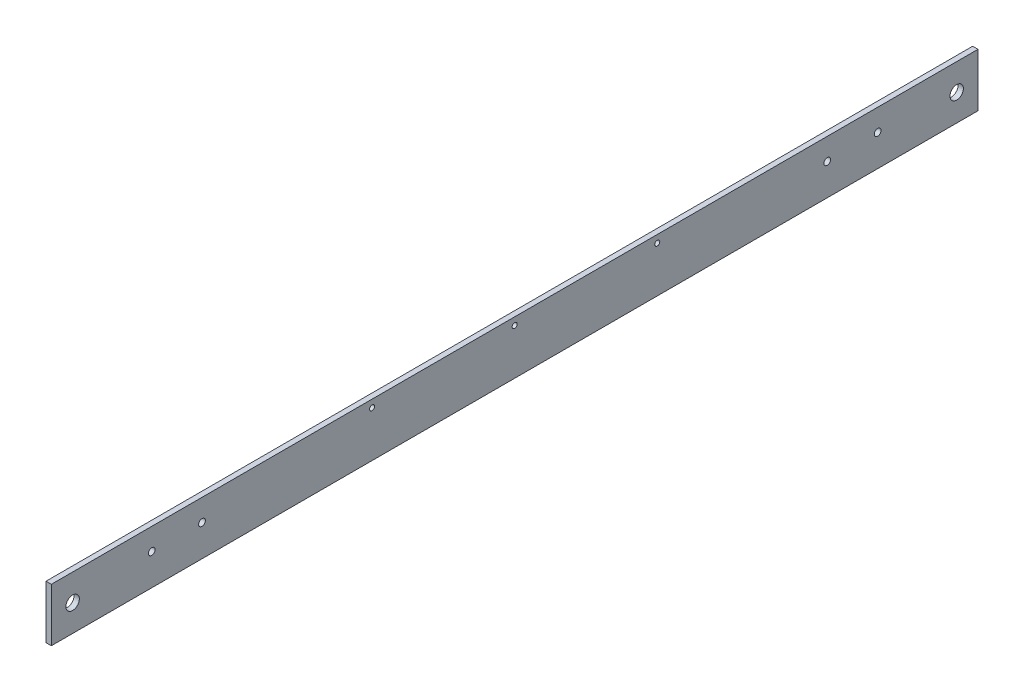
ISO-10303-21;
HEADER;
FILE_DESCRIPTION(('STEP AP214'),'2;1');
FILE_NAME('part.step','',(''),(''),'','','');
FILE_SCHEMA(('AUTOMOTIVE_DESIGN { 1 0 10303 214 1 1 1 1 }'));
ENDSEC;
DATA;
#1=APPLICATION_CONTEXT('core data for automotive mechanical design processes');
#2=APPLICATION_PROTOCOL_DEFINITION('international standard','automotive_design',2000,#1);
#3=PRODUCT_CONTEXT('',#1,'mechanical');
#4=PRODUCT('Part','Part','',(#3));
#5=PRODUCT_RELATED_PRODUCT_CATEGORY('part','',(#4));
#6=PRODUCT_DEFINITION_FORMATION('','',#4);
#7=PRODUCT_DEFINITION_CONTEXT('part definition',#1,'design');
#8=PRODUCT_DEFINITION('design','',#6,#7);
#9=PRODUCT_DEFINITION_SHAPE('','',#8);
#10=(LENGTH_UNIT() NAMED_UNIT(*) SI_UNIT(.MILLI.,.METRE.));
#11=(NAMED_UNIT(*) PLANE_ANGLE_UNIT() SI_UNIT($,.RADIAN.));
#12=(NAMED_UNIT(*) SI_UNIT($,.STERADIAN.) SOLID_ANGLE_UNIT());
#13=UNCERTAINTY_MEASURE_WITH_UNIT(LENGTH_MEASURE(1.E-05),#10,'distance_accuracy_value','');
#14=(GEOMETRIC_REPRESENTATION_CONTEXT(3) GLOBAL_UNCERTAINTY_ASSIGNED_CONTEXT((#13)) GLOBAL_UNIT_ASSIGNED_CONTEXT((#10,
#11,#12)) REPRESENTATION_CONTEXT('',''));
#15=CARTESIAN_POINT('',(0.,0.,0.));
#16=DIRECTION('',(0.,0.,1.));
#17=DIRECTION('',(1.,0.,0.));
#18=AXIS2_PLACEMENT_3D('',#15,#16,#17);
#19=CARTESIAN_POINT('',(3.175,0.,0.));
#20=DIRECTION('',(-1.,0.,0.));
#21=DIRECTION('',(0.,0.,1.));
#22=AXIS2_PLACEMENT_3D('',#19,#20,#21);
#23=PLANE('',#22);
#24=CARTESIAN_POINT('',(3.175,27.25,-191.225));
#25=DIRECTION('',(1.,0.,0.));
#26=DIRECTION('',(0.,0.,-1.));
#27=AXIS2_PLACEMENT_3D('',#24,#25,#26);
#28=CIRCLE('',#27,1.5);
#29=CARTESIAN_POINT('',(3.175,27.25,-192.725));
#30=VERTEX_POINT('',#29);
#31=EDGE_CURVE('E165',#30,#30,#28,.T.);
#32=ORIENTED_EDGE('',*,*,#31,.F.);
#33=EDGE_LOOP('',(#32));
#34=FACE_BOUND('',#33,.T.);
#35=CARTESIAN_POINT('',(3.175,27.25,-276.225));
#36=DIRECTION('',(1.,0.,0.));
#37=DIRECTION('',(0.,0.,-1.));
#38=AXIS2_PLACEMENT_3D('',#35,#36,#37);
#39=CIRCLE('',#38,1.50000000000002);
#40=CARTESIAN_POINT('',(3.175,27.25,-277.725));
#41=VERTEX_POINT('',#40);
#42=EDGE_CURVE('E162',#41,#41,#39,.T.);
#43=ORIENTED_EDGE('',*,*,#42,.F.);
#44=EDGE_LOOP('',(#43));
#45=FACE_BOUND('',#44,.T.);
#46=CARTESIAN_POINT('',(3.175,27.25,-361.225));
#47=DIRECTION('',(1.,0.,0.));
#48=DIRECTION('',(0.,0.,-1.));
#49=AXIS2_PLACEMENT_3D('',#46,#47,#48);
#50=CIRCLE('',#49,1.50000000000002);
#51=CARTESIAN_POINT('',(3.175,27.25,-362.725));
#52=VERTEX_POINT('',#51);
#53=EDGE_CURVE('E156',#52,#52,#50,.T.);
#54=ORIENTED_EDGE('',*,*,#53,.F.);
#55=EDGE_LOOP('',(#54));
#56=FACE_BOUND('',#55,.T.);
#57=DIRECTION('',(0.,-1.,0.));
#58=VECTOR('',#57,1.);
#59=CARTESIAN_POINT('',(3.175,0.,0.));
#60=LINE('',#59,#58);
#61=CARTESIAN_POINT('',(3.175,31.75,0.));
#62=VERTEX_POINT('',#61);
#63=CARTESIAN_POINT('',(3.175,0.,0.));
#64=VERTEX_POINT('',#63);
#65=EDGE_CURVE('E90',#62,#64,#60,.T.);
#66=ORIENTED_EDGE('',*,*,#65,.T.);
#67=DIRECTION('',(0.,0.,-1.));
#68=VECTOR('',#67,1.);
#69=CARTESIAN_POINT('',(3.175,0.,0.));
#70=LINE('',#69,#68);
#71=CARTESIAN_POINT('',(3.175,0.,-552.45));
#72=VERTEX_POINT('',#71);
#73=EDGE_CURVE('E85',#64,#72,#70,.T.);
#74=ORIENTED_EDGE('',*,*,#73,.T.);
#75=DIRECTION('',(0.,1.,0.));
#76=VECTOR('',#75,1.);
#77=CARTESIAN_POINT('',(3.175,0.,-552.45));
#78=LINE('',#77,#76);
#79=CARTESIAN_POINT('',(3.175,31.75,-552.45));
#80=VERTEX_POINT('',#79);
#81=EDGE_CURVE('E88',#72,#80,#78,.T.);
#82=ORIENTED_EDGE('',*,*,#81,.T.);
#83=DIRECTION('',(0.,0.,1.));
#84=VECTOR('',#83,1.);
#85=CARTESIAN_POINT('',(3.175,31.75,0.));
#86=LINE('',#85,#84);
#87=EDGE_CURVE('E55',#80,#62,#86,.T.);
#88=ORIENTED_EDGE('',*,*,#87,.T.);
#89=EDGE_LOOP('',(#66,#74,#82,#88));
#90=FACE_BOUND('',#89,.T.);
#91=CARTESIAN_POINT('',(3.175,15.875,-12.7));
#92=DIRECTION('',(1.,0.,0.));
#93=DIRECTION('',(0.,0.,-1.));
#94=AXIS2_PLACEMENT_3D('',#91,#92,#93);
#95=CIRCLE('',#94,4.);
#96=CARTESIAN_POINT('',(3.175,15.875,-16.7));
#97=VERTEX_POINT('',#96);
#98=EDGE_CURVE('E105',#97,#97,#95,.T.);
#99=ORIENTED_EDGE('',*,*,#98,.F.);
#100=EDGE_LOOP('',(#99));
#101=FACE_BOUND('',#100,.T.);
#102=CARTESIAN_POINT('',(3.175,15.875,-539.75));
#103=DIRECTION('',(1.,0.,0.));
#104=DIRECTION('',(0.,0.,-1.));
#105=AXIS2_PLACEMENT_3D('',#102,#103,#104);
#106=CIRCLE('',#105,3.99999999999999);
#107=CARTESIAN_POINT('',(3.175,15.875,-543.75));
#108=VERTEX_POINT('',#107);
#109=EDGE_CURVE('E120',#108,#108,#106,.T.);
#110=ORIENTED_EDGE('',*,*,#109,.F.);
#111=EDGE_LOOP('',(#110));
#112=FACE_BOUND('',#111,.T.);
#113=CARTESIAN_POINT('',(3.175,18.75,-462.625));
#114=DIRECTION('',(1.,0.,0.));
#115=DIRECTION('',(0.,0.,-1.));
#116=AXIS2_PLACEMENT_3D('',#113,#114,#115);
#117=CIRCLE('',#116,2.);
#118=CARTESIAN_POINT('',(3.175,18.75,-464.625));
#119=VERTEX_POINT('',#118);
#120=EDGE_CURVE('E126',#119,#119,#117,.T.);
#121=ORIENTED_EDGE('',*,*,#120,.F.);
#122=EDGE_LOOP('',(#121));
#123=FACE_BOUND('',#122,.T.);
#124=CARTESIAN_POINT('',(3.175,18.75,-492.625));
#125=DIRECTION('',(1.,0.,0.));
#126=DIRECTION('',(0.,0.,-1.));
#127=AXIS2_PLACEMENT_3D('',#124,#125,#126);
#128=CIRCLE('',#127,2.);
#129=CARTESIAN_POINT('',(3.175,18.75,-494.625));
#130=VERTEX_POINT('',#129);
#131=EDGE_CURVE('E132',#130,#130,#128,.T.);
#132=ORIENTED_EDGE('',*,*,#131,.F.);
#133=EDGE_LOOP('',(#132));
#134=FACE_BOUND('',#133,.T.);
#135=CARTESIAN_POINT('',(3.175,18.75,-59.825));
#136=DIRECTION('',(1.,0.,0.));
#137=DIRECTION('',(0.,0.,-1.));
#138=AXIS2_PLACEMENT_3D('',#135,#136,#137);
#139=CIRCLE('',#138,2.);
#140=CARTESIAN_POINT('',(3.175,18.75,-61.825));
#141=VERTEX_POINT('',#140);
#142=EDGE_CURVE('E138',#141,#141,#139,.T.);
#143=ORIENTED_EDGE('',*,*,#142,.F.);
#144=EDGE_LOOP('',(#143));
#145=FACE_BOUND('',#144,.T.);
#146=CARTESIAN_POINT('',(3.175,18.75,-89.825));
#147=DIRECTION('',(1.,0.,0.));
#148=DIRECTION('',(0.,0.,-1.));
#149=AXIS2_PLACEMENT_3D('',#146,#147,#148);
#150=CIRCLE('',#149,2.);
#151=CARTESIAN_POINT('',(3.175,18.75,-91.825));
#152=VERTEX_POINT('',#151);
#153=EDGE_CURVE('E144',#152,#152,#150,.T.);
#154=ORIENTED_EDGE('',*,*,#153,.F.);
#155=EDGE_LOOP('',(#154));
#156=FACE_BOUND('',#155,.T.);
#157=ADVANCED_FACE('F38',(#34,#45,#56,#90,#101,#112,#123,#134,#145,#156),#23,.F.);
#158=CARTESIAN_POINT('',(0.,0.,0.));
#159=DIRECTION('',(-1.,0.,0.));
#160=DIRECTION('',(0.,0.,1.));
#161=AXIS2_PLACEMENT_3D('',#158,#159,#160);
#162=PLANE('',#161);
#163=CARTESIAN_POINT('',(0.,27.25,-191.225));
#164=DIRECTION('',(1.,0.,0.));
#165=DIRECTION('',(0.,0.,-1.));
#166=AXIS2_PLACEMENT_3D('',#163,#164,#165);
#167=CIRCLE('',#166,1.5);
#168=CARTESIAN_POINT('',(0.,27.25,-192.725));
#169=VERTEX_POINT('',#168);
#170=EDGE_CURVE('E150',#169,#169,#167,.T.);
#171=ORIENTED_EDGE('',*,*,#170,.T.);
#172=EDGE_LOOP('',(#171));
#173=FACE_BOUND('',#172,.T.);
#174=CARTESIAN_POINT('',(0.,27.25,-276.225));
#175=DIRECTION('',(1.,0.,0.));
#176=DIRECTION('',(0.,0.,-1.));
#177=AXIS2_PLACEMENT_3D('',#174,#175,#176);
#178=CIRCLE('',#177,1.50000000000002);
#179=CARTESIAN_POINT('',(0.,27.25,-277.725));
#180=VERTEX_POINT('',#179);
#181=EDGE_CURVE('E159',#180,#180,#178,.T.);
#182=ORIENTED_EDGE('',*,*,#181,.T.);
#183=EDGE_LOOP('',(#182));
#184=FACE_BOUND('',#183,.T.);
#185=CARTESIAN_POINT('',(0.,27.25,-361.225));
#186=DIRECTION('',(1.,0.,0.));
#187=DIRECTION('',(0.,0.,-1.));
#188=AXIS2_PLACEMENT_3D('',#185,#186,#187);
#189=CIRCLE('',#188,1.50000000000002);
#190=CARTESIAN_POINT('',(0.,27.25,-362.725));
#191=VERTEX_POINT('',#190);
#192=EDGE_CURVE('E153',#191,#191,#189,.T.);
#193=ORIENTED_EDGE('',*,*,#192,.T.);
#194=EDGE_LOOP('',(#193));
#195=FACE_BOUND('',#194,.T.);
#196=CARTESIAN_POINT('',(0.,18.75,-59.825));
#197=DIRECTION('',(1.,0.,0.));
#198=DIRECTION('',(0.,0.,-1.));
#199=AXIS2_PLACEMENT_3D('',#196,#197,#198);
#200=CIRCLE('',#199,2.);
#201=CARTESIAN_POINT('',(0.,18.75,-61.825));
#202=VERTEX_POINT('',#201);
#203=EDGE_CURVE('E141',#202,#202,#200,.T.);
#204=ORIENTED_EDGE('',*,*,#203,.T.);
#205=EDGE_LOOP('',(#204));
#206=FACE_BOUND('',#205,.T.);
#207=CARTESIAN_POINT('',(0.,18.75,-462.625));
#208=DIRECTION('',(1.,0.,0.));
#209=DIRECTION('',(0.,0.,-1.));
#210=AXIS2_PLACEMENT_3D('',#207,#208,#209);
#211=CIRCLE('',#210,2.);
#212=CARTESIAN_POINT('',(0.,18.75,-464.625));
#213=VERTEX_POINT('',#212);
#214=EDGE_CURVE('E129',#213,#213,#211,.T.);
#215=ORIENTED_EDGE('',*,*,#214,.T.);
#216=EDGE_LOOP('',(#215));
#217=FACE_BOUND('',#216,.T.);
#218=CARTESIAN_POINT('',(0.,15.875,-12.7));
#219=DIRECTION('',(1.,0.,0.));
#220=DIRECTION('',(0.,0.,-1.));
#221=AXIS2_PLACEMENT_3D('',#218,#219,#220);
#222=CIRCLE('',#221,4.);
#223=CARTESIAN_POINT('',(0.,15.875,-16.7));
#224=VERTEX_POINT('',#223);
#225=EDGE_CURVE('E117',#224,#224,#222,.T.);
#226=ORIENTED_EDGE('',*,*,#225,.T.);
#227=EDGE_LOOP('',(#226));
#228=FACE_BOUND('',#227,.T.);
#229=DIRECTION('',(0.,-1.,0.));
#230=VECTOR('',#229,1.);
#231=CARTESIAN_POINT('',(0.,0.,0.));
#232=LINE('',#231,#230);
#233=CARTESIAN_POINT('',(0.,31.75,0.));
#234=VERTEX_POINT('',#233);
#235=CARTESIAN_POINT('',(0.,0.,0.));
#236=VERTEX_POINT('',#235);
#237=EDGE_CURVE('E102',#234,#236,#232,.T.);
#238=ORIENTED_EDGE('',*,*,#237,.F.);
#239=DIRECTION('',(0.,0.,1.));
#240=VECTOR('',#239,1.);
#241=CARTESIAN_POINT('',(0.,31.75,0.));
#242=LINE('',#241,#240);
#243=CARTESIAN_POINT('',(0.,31.75,-552.45));
#244=VERTEX_POINT('',#243);
#245=EDGE_CURVE('E78',#244,#234,#242,.T.);
#246=ORIENTED_EDGE('',*,*,#245,.F.);
#247=DIRECTION('',(0.,1.,0.));
#248=VECTOR('',#247,1.);
#249=CARTESIAN_POINT('',(0.,0.,-552.45));
#250=LINE('',#249,#248);
#251=CARTESIAN_POINT('',(0.,0.,-552.45));
#252=VERTEX_POINT('',#251);
#253=EDGE_CURVE('E72',#252,#244,#250,.T.);
#254=ORIENTED_EDGE('',*,*,#253,.F.);
#255=DIRECTION('',(0.,0.,-1.));
#256=VECTOR('',#255,1.);
#257=CARTESIAN_POINT('',(0.,0.,0.));
#258=LINE('',#257,#256);
#259=EDGE_CURVE('E94',#236,#252,#258,.T.);
#260=ORIENTED_EDGE('',*,*,#259,.F.);
#261=EDGE_LOOP('',(#238,#246,#254,#260));
#262=FACE_BOUND('',#261,.T.);
#263=CARTESIAN_POINT('',(0.,15.875,-539.75));
#264=DIRECTION('',(1.,0.,0.));
#265=DIRECTION('',(0.,0.,-1.));
#266=AXIS2_PLACEMENT_3D('',#263,#264,#265);
#267=CIRCLE('',#266,3.99999999999999);
#268=CARTESIAN_POINT('',(0.,15.875,-543.75));
#269=VERTEX_POINT('',#268);
#270=EDGE_CURVE('E123',#269,#269,#267,.T.);
#271=ORIENTED_EDGE('',*,*,#270,.T.);
#272=EDGE_LOOP('',(#271));
#273=FACE_BOUND('',#272,.T.);
#274=CARTESIAN_POINT('',(0.,18.75,-492.625));
#275=DIRECTION('',(1.,0.,0.));
#276=DIRECTION('',(0.,0.,-1.));
#277=AXIS2_PLACEMENT_3D('',#274,#275,#276);
#278=CIRCLE('',#277,2.);
#279=CARTESIAN_POINT('',(0.,18.75,-494.625));
#280=VERTEX_POINT('',#279);
#281=EDGE_CURVE('E135',#280,#280,#278,.T.);
#282=ORIENTED_EDGE('',*,*,#281,.T.);
#283=EDGE_LOOP('',(#282));
#284=FACE_BOUND('',#283,.T.);
#285=CARTESIAN_POINT('',(0.,18.75,-89.825));
#286=DIRECTION('',(1.,0.,0.));
#287=DIRECTION('',(0.,0.,-1.));
#288=AXIS2_PLACEMENT_3D('',#285,#286,#287);
#289=CIRCLE('',#288,2.);
#290=CARTESIAN_POINT('',(0.,18.75,-91.825));
#291=VERTEX_POINT('',#290);
#292=EDGE_CURVE('E147',#291,#291,#289,.T.);
#293=ORIENTED_EDGE('',*,*,#292,.T.);
#294=EDGE_LOOP('',(#293));
#295=FACE_BOUND('',#294,.T.);
#296=ADVANCED_FACE('F113',(#173,#184,#195,#206,#217,#228,#262,#273,#284,#295),#162,.T.);
#297=CARTESIAN_POINT('',(3.175,0.,0.));
#298=DIRECTION('',(0.,0.,-1.));
#299=DIRECTION('',(-1.,0.,0.));
#300=AXIS2_PLACEMENT_3D('',#297,#298,#299);
#301=PLANE('',#300);
#302=ORIENTED_EDGE('',*,*,#237,.T.);
#303=DIRECTION('',(-1.,0.,0.));
#304=VECTOR('',#303,1.);
#305=CARTESIAN_POINT('',(3.175,0.,0.));
#306=LINE('',#305,#304);
#307=EDGE_CURVE('E11',#64,#236,#306,.T.);
#308=ORIENTED_EDGE('',*,*,#307,.F.);
#309=ORIENTED_EDGE('',*,*,#65,.F.);
#310=DIRECTION('',(-1.,0.,0.));
#311=VECTOR('',#310,1.);
#312=CARTESIAN_POINT('',(3.175,31.75,0.));
#313=LINE('',#312,#311);
#314=EDGE_CURVE('E98',#62,#234,#313,.T.);
#315=ORIENTED_EDGE('',*,*,#314,.T.);
#316=EDGE_LOOP('',(#302,#308,#309,#315));
#317=FACE_BOUND('',#316,.T.);
#318=ADVANCED_FACE('F40',(#317),#301,.F.);
#319=CARTESIAN_POINT('',(3.175,0.,0.));
#320=DIRECTION('',(0.,1.,0.));
#321=DIRECTION('',(0.,0.,1.));
#322=AXIS2_PLACEMENT_3D('',#319,#320,#321);
#323=PLANE('',#322);
#324=ORIENTED_EDGE('',*,*,#259,.T.);
#325=DIRECTION('',(-1.,0.,0.));
#326=VECTOR('',#325,1.);
#327=CARTESIAN_POINT('',(3.175,0.,-552.45));
#328=LINE('',#327,#326);
#329=EDGE_CURVE('E47',#72,#252,#328,.T.);
#330=ORIENTED_EDGE('',*,*,#329,.F.);
#331=ORIENTED_EDGE('',*,*,#73,.F.);
#332=ORIENTED_EDGE('',*,*,#307,.T.);
#333=EDGE_LOOP('',(#324,#330,#331,#332));
#334=FACE_BOUND('',#333,.T.);
#335=ADVANCED_FACE('F93',(#334),#323,.F.);
#336=CARTESIAN_POINT('',(3.175,0.,-552.45));
#337=DIRECTION('',(0.,0.,1.));
#338=DIRECTION('',(1.,0.,0.));
#339=AXIS2_PLACEMENT_3D('',#336,#337,#338);
#340=PLANE('',#339);
#341=ORIENTED_EDGE('',*,*,#253,.T.);
#342=DIRECTION('',(-1.,0.,0.));
#343=VECTOR('',#342,1.);
#344=CARTESIAN_POINT('',(3.175,31.75,-552.45));
#345=LINE('',#344,#343);
#346=EDGE_CURVE('E95',#80,#244,#345,.T.);
#347=ORIENTED_EDGE('',*,*,#346,.F.);
#348=ORIENTED_EDGE('',*,*,#81,.F.);
#349=ORIENTED_EDGE('',*,*,#329,.T.);
#350=EDGE_LOOP('',(#341,#347,#348,#349));
#351=FACE_BOUND('',#350,.T.);
#352=ADVANCED_FACE('F96',(#351),#340,.F.);
#353=CARTESIAN_POINT('',(3.175,31.75,0.));
#354=DIRECTION('',(0.,-1.,0.));
#355=DIRECTION('',(0.,0.,-1.));
#356=AXIS2_PLACEMENT_3D('',#353,#354,#355);
#357=PLANE('',#356);
#358=ORIENTED_EDGE('',*,*,#245,.T.);
#359=ORIENTED_EDGE('',*,*,#314,.F.);
#360=ORIENTED_EDGE('',*,*,#87,.F.);
#361=ORIENTED_EDGE('',*,*,#346,.T.);
#362=EDGE_LOOP('',(#358,#359,#360,#361));
#363=FACE_BOUND('',#362,.T.);
#364=ADVANCED_FACE('F110',(#363),#357,.F.);
#365=CARTESIAN_POINT('',(3.175,15.875,-12.7));
#366=DIRECTION('',(-1.,0.,0.));
#367=DIRECTION('',(0.,0.,1.));
#368=AXIS2_PLACEMENT_3D('',#365,#366,#367);
#369=CYLINDRICAL_SURFACE('',#368,4.);
#370=ORIENTED_EDGE('',*,*,#98,.T.);
#371=EDGE_LOOP('',(#370));
#372=FACE_BOUND('',#371,.T.);
#373=ORIENTED_EDGE('',*,*,#225,.F.);
#374=EDGE_LOOP('',(#373));
#375=FACE_BOUND('',#374,.T.);
#376=ADVANCED_FACE('F218',(#372,#375),#369,.F.);
#377=CARTESIAN_POINT('',(3.175,15.875,-539.75));
#378=DIRECTION('',(-1.,0.,0.));
#379=DIRECTION('',(0.,0.,1.));
#380=AXIS2_PLACEMENT_3D('',#377,#378,#379);
#381=CYLINDRICAL_SURFACE('',#380,3.99999999999999);
#382=ORIENTED_EDGE('',*,*,#109,.T.);
#383=EDGE_LOOP('',(#382));
#384=FACE_BOUND('',#383,.T.);
#385=ORIENTED_EDGE('',*,*,#270,.F.);
#386=EDGE_LOOP('',(#385));
#387=FACE_BOUND('',#386,.T.);
#388=ADVANCED_FACE('F214',(#384,#387),#381,.F.);
#389=CARTESIAN_POINT('',(3.175,18.75,-462.625));
#390=DIRECTION('',(-1.,0.,0.));
#391=DIRECTION('',(0.,0.,1.));
#392=AXIS2_PLACEMENT_3D('',#389,#390,#391);
#393=CYLINDRICAL_SURFACE('',#392,2.);
#394=ORIENTED_EDGE('',*,*,#120,.T.);
#395=EDGE_LOOP('',(#394));
#396=FACE_BOUND('',#395,.T.);
#397=ORIENTED_EDGE('',*,*,#214,.F.);
#398=EDGE_LOOP('',(#397));
#399=FACE_BOUND('',#398,.T.);
#400=ADVANCED_FACE('F210',(#396,#399),#393,.F.);
#401=CARTESIAN_POINT('',(3.175,18.75,-492.625));
#402=DIRECTION('',(-1.,0.,0.));
#403=DIRECTION('',(0.,0.,1.));
#404=AXIS2_PLACEMENT_3D('',#401,#402,#403);
#405=CYLINDRICAL_SURFACE('',#404,2.);
#406=ORIENTED_EDGE('',*,*,#131,.T.);
#407=EDGE_LOOP('',(#406));
#408=FACE_BOUND('',#407,.T.);
#409=ORIENTED_EDGE('',*,*,#281,.F.);
#410=EDGE_LOOP('',(#409));
#411=FACE_BOUND('',#410,.T.);
#412=ADVANCED_FACE('F206',(#408,#411),#405,.F.);
#413=CARTESIAN_POINT('',(3.175,18.75,-59.825));
#414=DIRECTION('',(-1.,0.,0.));
#415=DIRECTION('',(0.,0.,1.));
#416=AXIS2_PLACEMENT_3D('',#413,#414,#415);
#417=CYLINDRICAL_SURFACE('',#416,2.);
#418=ORIENTED_EDGE('',*,*,#142,.T.);
#419=EDGE_LOOP('',(#418));
#420=FACE_BOUND('',#419,.T.);
#421=ORIENTED_EDGE('',*,*,#203,.F.);
#422=EDGE_LOOP('',(#421));
#423=FACE_BOUND('',#422,.T.);
#424=ADVANCED_FACE('F199',(#420,#423),#417,.F.);
#425=CARTESIAN_POINT('',(3.175,18.75,-89.825));
#426=DIRECTION('',(-1.,0.,0.));
#427=DIRECTION('',(0.,0.,1.));
#428=AXIS2_PLACEMENT_3D('',#425,#426,#427);
#429=CYLINDRICAL_SURFACE('',#428,2.);
#430=ORIENTED_EDGE('',*,*,#153,.T.);
#431=EDGE_LOOP('',(#430));
#432=FACE_BOUND('',#431,.T.);
#433=ORIENTED_EDGE('',*,*,#292,.F.);
#434=EDGE_LOOP('',(#433));
#435=FACE_BOUND('',#434,.T.);
#436=ADVANCED_FACE('F189',(#432,#435),#429,.F.);
#437=CARTESIAN_POINT('',(0.,27.25,-361.225));
#438=DIRECTION('',(1.,0.,0.));
#439=DIRECTION('',(0.,0.,-1.));
#440=AXIS2_PLACEMENT_3D('',#437,#438,#439);
#441=CYLINDRICAL_SURFACE('',#440,1.50000000000002);
#442=ORIENTED_EDGE('',*,*,#192,.F.);
#443=EDGE_LOOP('',(#442));
#444=FACE_BOUND('',#443,.T.);
#445=ORIENTED_EDGE('',*,*,#53,.T.);
#446=EDGE_LOOP('',(#445));
#447=FACE_BOUND('',#446,.T.);
#448=ADVANCED_FACE('F187',(#444,#447),#441,.F.);
#449=CARTESIAN_POINT('',(0.,27.25,-276.225));
#450=DIRECTION('',(1.,0.,0.));
#451=DIRECTION('',(0.,0.,-1.));
#452=AXIS2_PLACEMENT_3D('',#449,#450,#451);
#453=CYLINDRICAL_SURFACE('',#452,1.50000000000002);
#454=ORIENTED_EDGE('',*,*,#181,.F.);
#455=EDGE_LOOP('',(#454));
#456=FACE_BOUND('',#455,.T.);
#457=ORIENTED_EDGE('',*,*,#42,.T.);
#458=EDGE_LOOP('',(#457));
#459=FACE_BOUND('',#458,.T.);
#460=ADVANCED_FACE('F176',(#456,#459),#453,.F.);
#461=CARTESIAN_POINT('',(0.,27.25,-191.225));
#462=DIRECTION('',(1.,0.,0.));
#463=DIRECTION('',(0.,0.,-1.));
#464=AXIS2_PLACEMENT_3D('',#461,#462,#463);
#465=CYLINDRICAL_SURFACE('',#464,1.5);
#466=ORIENTED_EDGE('',*,*,#170,.F.);
#467=EDGE_LOOP('',(#466));
#468=FACE_BOUND('',#467,.T.);
#469=ORIENTED_EDGE('',*,*,#31,.T.);
#470=EDGE_LOOP('',(#469));
#471=FACE_BOUND('',#470,.T.);
#472=ADVANCED_FACE('F173',(#468,#471),#465,.F.);
#473=CLOSED_SHELL('',(#157,#296,#318,#335,#352,#364,#376,#388,#400,#412,#424,#436,#448,#460,#472));
#474=MANIFOLD_SOLID_BREP('B2',#473);
#475=ADVANCED_BREP_SHAPE_REPRESENTATION('',(#18,#474),#14);
#476=SHAPE_DEFINITION_REPRESENTATION(#9,#475);
ENDSEC;
END-ISO-10303-21;
